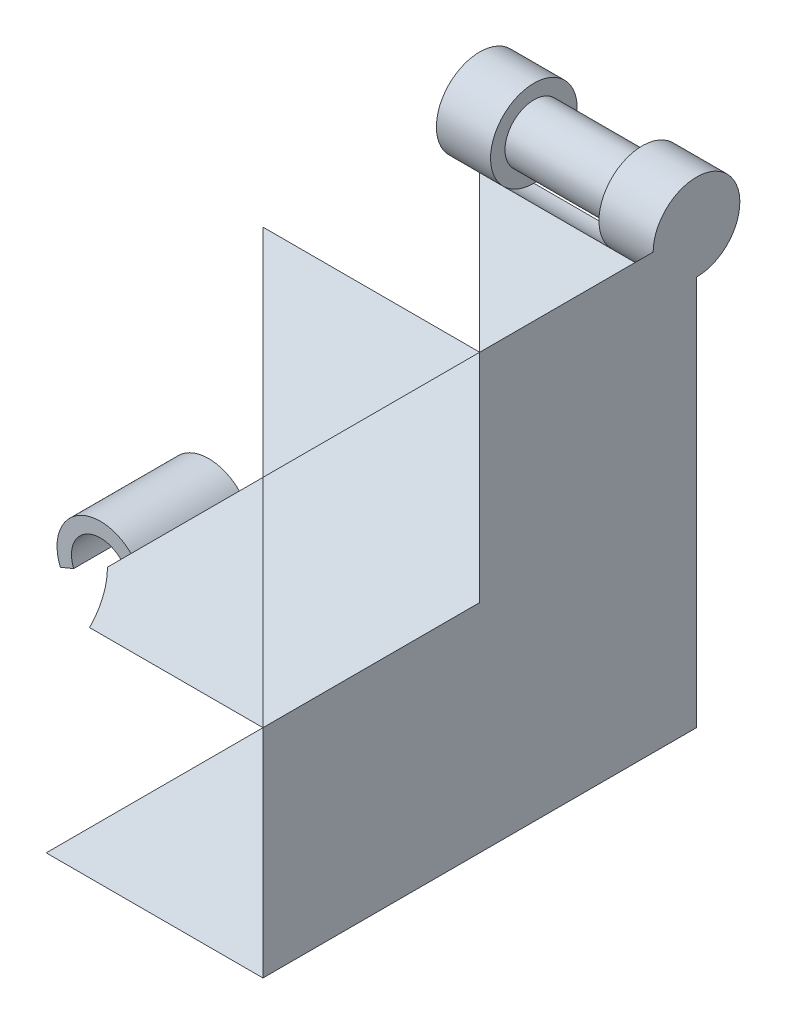
ISO-10303-21;
HEADER;
FILE_DESCRIPTION(('STEP AP214'),'2;1');
FILE_NAME('part.step','',(''),(''),'','','');
FILE_SCHEMA(('AUTOMOTIVE_DESIGN { 1 0 10303 214 1 1 1 1 }'));
ENDSEC;
DATA;
#1=APPLICATION_CONTEXT('core data for automotive mechanical design processes');
#2=APPLICATION_PROTOCOL_DEFINITION('international standard','automotive_design',2000,#1);
#3=PRODUCT_CONTEXT('',#1,'mechanical');
#4=PRODUCT('Part','Part','',(#3));
#5=PRODUCT_RELATED_PRODUCT_CATEGORY('part','',(#4));
#6=PRODUCT_DEFINITION_FORMATION('','',#4);
#7=PRODUCT_DEFINITION_CONTEXT('part definition',#1,'design');
#8=PRODUCT_DEFINITION('design','',#6,#7);
#9=PRODUCT_DEFINITION_SHAPE('','',#8);
#10=(LENGTH_UNIT() NAMED_UNIT(*) SI_UNIT(.MILLI.,.METRE.));
#11=(NAMED_UNIT(*) PLANE_ANGLE_UNIT() SI_UNIT($,.RADIAN.));
#12=(NAMED_UNIT(*) SI_UNIT($,.STERADIAN.) SOLID_ANGLE_UNIT());
#13=UNCERTAINTY_MEASURE_WITH_UNIT(LENGTH_MEASURE(1.E-05),#10,'distance_accuracy_value','');
#14=(GEOMETRIC_REPRESENTATION_CONTEXT(3) GLOBAL_UNCERTAINTY_ASSIGNED_CONTEXT((#13)) GLOBAL_UNIT_ASSIGNED_CONTEXT((#10,
#11,#12)) REPRESENTATION_CONTEXT('',''));
#15=CARTESIAN_POINT('',(0.,0.,0.));
#16=DIRECTION('',(0.,0.,1.));
#17=DIRECTION('',(1.,0.,0.));
#18=AXIS2_PLACEMENT_3D('',#15,#16,#17);
#19=CARTESIAN_POINT('',(0.,0.,0.));
#20=DIRECTION('',(0.,0.,-1.));
#21=DIRECTION('',(1.,0.,0.));
#22=AXIS2_PLACEMENT_3D('',#19,#20,#21);
#23=PLANE('',#22);
#24=DIRECTION('',(1.,0.,0.));
#25=VECTOR('',#24,1.);
#26=CARTESIAN_POINT('',(-25.063807345283,34.29,0.));
#27=LINE('',#26,#25);
#28=CARTESIAN_POINT('',(-4.7625,34.29,0.));
#29=VERTEX_POINT('',#28);
#30=CARTESIAN_POINT('',(-14.2875,34.29,0.));
#31=VERTEX_POINT('',#30);
#32=EDGE_CURVE('E224',#29,#31,#27,.F.);
#33=ORIENTED_EDGE('',*,*,#32,.F.);
#34=DIRECTION('',(1.,0.,0.));
#35=VECTOR('',#34,1.);
#36=CARTESIAN_POINT('',(-15.538807345283,34.29,0.));
#37=LINE('',#36,#35);
#38=CARTESIAN_POINT('',(0.,34.29,0.));
#39=VERTEX_POINT('',#38);
#40=EDGE_CURVE('E213',#39,#29,#37,.F.);
#41=ORIENTED_EDGE('',*,*,#40,.F.);
#42=DIRECTION('',(0.,-1.,0.));
#43=VECTOR('',#42,1.);
#44=CARTESIAN_POINT('',(0.,0.,0.));
#45=LINE('',#44,#43);
#46=CARTESIAN_POINT('',(0.,0.,0.));
#47=VERTEX_POINT('',#46);
#48=EDGE_CURVE('E185',#39,#47,#45,.T.);
#49=ORIENTED_EDGE('',*,*,#48,.T.);
#50=DIRECTION('',(-1.,0.,0.));
#51=VECTOR('',#50,1.);
#52=CARTESIAN_POINT('',(0.,0.,0.));
#53=LINE('',#52,#51);
#54=CARTESIAN_POINT('',(-34.29,0.,0.));
#55=VERTEX_POINT('',#54);
#56=EDGE_CURVE('E384',#47,#55,#53,.T.);
#57=ORIENTED_EDGE('',*,*,#56,.T.);
#58=CARTESIAN_POINT('',(-38.1,0.,0.));
#59=DIRECTION('',(0.,0.,-1.));
#60=DIRECTION('',(-1.,0.,0.));
#61=AXIS2_PLACEMENT_3D('',#58,#59,#60);
#62=CIRCLE('',#61,3.81);
#63=CARTESIAN_POINT('',(-38.1,3.81,0.));
#64=VERTEX_POINT('',#63);
#65=EDGE_CURVE('E253',#64,#55,#62,.T.);
#66=ORIENTED_EDGE('',*,*,#65,.F.);
#67=DIRECTION('',(0.,1.,0.));
#68=VECTOR('',#67,1.);
#69=CARTESIAN_POINT('',(-38.1,0.,0.));
#70=LINE('',#69,#68);
#71=CARTESIAN_POINT('',(-38.1,19.05,0.));
#72=VERTEX_POINT('',#71);
#73=EDGE_CURVE('E327',#64,#72,#70,.T.);
#74=ORIENTED_EDGE('',*,*,#73,.T.);
#75=DIRECTION('',(1.,0.,0.));
#76=VECTOR('',#75,1.);
#77=CARTESIAN_POINT('',(-19.05,19.05,0.));
#78=LINE('',#77,#76);
#79=CARTESIAN_POINT('',(-19.05,19.05,0.));
#80=VERTEX_POINT('',#79);
#81=EDGE_CURVE('E352',#72,#80,#78,.T.);
#82=ORIENTED_EDGE('',*,*,#81,.T.);
#83=DIRECTION('',(0.,1.,0.));
#84=VECTOR('',#83,1.);
#85=CARTESIAN_POINT('',(-19.05,19.05,0.));
#86=LINE('',#85,#84);
#87=CARTESIAN_POINT('',(-19.05,34.29,0.));
#88=VERTEX_POINT('',#87);
#89=EDGE_CURVE('E335',#80,#88,#86,.T.);
#90=ORIENTED_EDGE('',*,*,#89,.T.);
#91=DIRECTION('',(1.,0.,0.));
#92=VECTOR('',#91,1.);
#93=CARTESIAN_POINT('',(-19.05,34.29,0.));
#94=LINE('',#93,#92);
#95=EDGE_CURVE('E192',#31,#88,#94,.F.);
#96=ORIENTED_EDGE('',*,*,#95,.F.);
#97=EDGE_LOOP('',(#33,#41,#49,#57,#66,#74,#82,#90,#96));
#98=FACE_BOUND('',#97,.T.);
#99=ADVANCED_FACE('F44',(#98),#23,.T.);
#100=CARTESIAN_POINT('',(0.,38.1,0.));
#101=DIRECTION('',(0.,0.707106781186546,0.707106781186549));
#102=DIRECTION('',(0.,-0.707106781186549,0.707106781186546));
#103=AXIS2_PLACEMENT_3D('',#100,#101,#102);
#104=PLANE('',#103);
#105=DIRECTION('',(1.,0.,0.));
#106=VECTOR('',#105,1.);
#107=CARTESIAN_POINT('',(-19.05,35.4059231636793,2.69407683632078));
#108=LINE('',#107,#106);
#109=CARTESIAN_POINT('',(-14.2875,35.4059231636793,2.69407683632077));
#110=VERTEX_POINT('',#109);
#111=CARTESIAN_POINT('',(-16.3559231636792,35.4059231636793,2.69407683632078));
#112=VERTEX_POINT('',#111);
#113=EDGE_CURVE('E556',#110,#112,#108,.F.);
#114=ORIENTED_EDGE('',*,*,#113,.T.);
#115=DIRECTION('',(-0.577350269189627,0.577350269189627,-0.577350269189624));
#116=VECTOR('',#115,1.);
#117=CARTESIAN_POINT('',(-12.7,31.75,6.35000000000003));
#118=LINE('',#117,#116);
#119=CARTESIAN_POINT('',(-9.525,28.575,9.525));
#120=VERTEX_POINT('',#119);
#121=EDGE_CURVE('E203',#120,#112,#118,.T.);
#122=ORIENTED_EDGE('',*,*,#121,.F.);
#123=DIRECTION('',(0.577350269189627,0.577350269189627,-0.577350269189624));
#124=VECTOR('',#123,1.);
#125=CARTESIAN_POINT('',(-6.35000000000001,31.75,6.35000000000003));
#126=LINE('',#125,#124);
#127=CARTESIAN_POINT('',(-2.69407683632075,35.4059231636793,2.69407683632078));
#128=VERTEX_POINT('',#127);
#129=EDGE_CURVE('E202',#120,#128,#126,.T.);
#130=ORIENTED_EDGE('',*,*,#129,.T.);
#131=DIRECTION('',(1.,0.,0.));
#132=VECTOR('',#131,1.);
#133=CARTESIAN_POINT('',(-15.538807345283,35.4059231636793,2.69407683632078));
#134=LINE('',#133,#132);
#135=CARTESIAN_POINT('',(-4.7625,35.4059231636793,2.69407683632077));
#136=VERTEX_POINT('',#135);
#137=EDGE_CURVE('E207',#128,#136,#134,.F.);
#138=ORIENTED_EDGE('',*,*,#137,.T.);
#139=DIRECTION('',(1.,0.,0.));
#140=VECTOR('',#139,1.);
#141=CARTESIAN_POINT('',(-25.063807345283,35.4059231636793,2.69407683632077));
#142=LINE('',#141,#140);
#143=EDGE_CURVE('E11',#136,#110,#142,.F.);
#144=ORIENTED_EDGE('',*,*,#143,.T.);
#145=EDGE_LOOP('',(#114,#122,#130,#138,#144));
#146=FACE_BOUND('',#145,.T.);
#147=ADVANCED_FACE('F490',(#146),#104,.T.);
#148=CARTESIAN_POINT('',(-19.05,19.05,0.));
#149=DIRECTION('',(-0.707106781186546,0.,0.707106781186549));
#150=DIRECTION('',(-0.707106781186549,0.,-0.707106781186546));
#151=AXIS2_PLACEMENT_3D('',#148,#149,#150);
#152=PLANE('',#151);
#153=CARTESIAN_POINT('',(-19.05,38.1,0.));
#154=DIRECTION('',(0.707106781186546,0.,-0.707106781186549));
#155=DIRECTION('',(0.707106781186549,0.,0.707106781186546));
#156=AXIS2_PLACEMENT_3D('',#153,#154,#155);
#157=ELLIPSE('',#156,5.3881536726415,3.81);
#158=EDGE_CURVE('E60',#112,#88,#157,.T.);
#159=ORIENTED_EDGE('',*,*,#158,.T.);
#160=ORIENTED_EDGE('',*,*,#89,.F.);
#161=DIRECTION('',(-0.577350269189627,-0.577350269189626,-0.577350269189625));
#162=VECTOR('',#161,1.);
#163=CARTESIAN_POINT('',(-12.7,25.4000000000001,6.35000000000003));
#164=LINE('',#163,#162);
#165=EDGE_CURVE('E338',#120,#80,#164,.T.);
#166=ORIENTED_EDGE('',*,*,#165,.F.);
#167=ORIENTED_EDGE('',*,*,#121,.T.);
#168=EDGE_LOOP('',(#159,#160,#166,#167));
#169=FACE_BOUND('',#168,.T.);
#170=ADVANCED_FACE('F496',(#169),#152,.T.);
#171=CARTESIAN_POINT('',(0.,38.1,19.05));
#172=DIRECTION('',(-0.707106781186549,0.707106781186546,0.));
#173=DIRECTION('',(-0.707106781186546,-0.707106781186549,0.));
#174=AXIS2_PLACEMENT_3D('',#171,#172,#173);
#175=PLANE('',#174);
#176=CARTESIAN_POINT('',(0.,38.1,0.));
#177=DIRECTION('',(0.707106781186549,-0.707106781186546,0.));
#178=DIRECTION('',(0.707106781186546,0.707106781186549,0.));
#179=AXIS2_PLACEMENT_3D('',#176,#177,#178);
#180=ELLIPSE('',#179,5.38815367264148,3.81);
#181=CARTESIAN_POINT('',(0.,38.1,3.81000000000003));
#182=VERTEX_POINT('',#181);
#183=EDGE_CURVE('E197',#182,#128,#180,.T.);
#184=ORIENTED_EDGE('',*,*,#183,.T.);
#185=ORIENTED_EDGE('',*,*,#129,.F.);
#186=DIRECTION('',(0.577350269189622,0.577350269189627,0.577350269189629));
#187=VECTOR('',#186,1.);
#188=CARTESIAN_POINT('',(-6.35000000000004,31.75,12.7));
#189=LINE('',#188,#187);
#190=CARTESIAN_POINT('',(0.,38.1,19.05));
#191=VERTEX_POINT('',#190);
#192=EDGE_CURVE('E200',#120,#191,#189,.T.);
#193=ORIENTED_EDGE('',*,*,#192,.T.);
#194=DIRECTION('',(0.,0.,1.));
#195=VECTOR('',#194,1.);
#196=CARTESIAN_POINT('',(0.,38.1,19.05));
#197=LINE('',#196,#195);
#198=EDGE_CURVE('E182',#182,#191,#197,.T.);
#199=ORIENTED_EDGE('',*,*,#198,.F.);
#200=EDGE_LOOP('',(#184,#185,#193,#199));
#201=FACE_BOUND('',#200,.T.);
#202=ADVANCED_FACE('F195',(#201),#175,.T.);
#203=CARTESIAN_POINT('',(0.,0.,38.1));
#204=DIRECTION('',(0.,-1.,0.));
#205=DIRECTION('',(1.,0.,0.));
#206=AXIS2_PLACEMENT_3D('',#203,#204,#205);
#207=PLANE('',#206);
#208=DIRECTION('',(0.,0.,-1.));
#209=VECTOR('',#208,1.);
#210=CARTESIAN_POINT('',(-34.29,0.,14.2875));
#211=LINE('',#210,#209);
#212=CARTESIAN_POINT('',(-34.29,0.,4.7625));
#213=VERTEX_POINT('',#212);
#214=CARTESIAN_POINT('',(-34.29,0.,14.2875));
#215=VERTEX_POINT('',#214);
#216=EDGE_CURVE('E320',#213,#215,#211,.F.);
#217=ORIENTED_EDGE('',*,*,#216,.F.);
#218=DIRECTION('',(0.,0.,-1.));
#219=VECTOR('',#218,1.);
#220=CARTESIAN_POINT('',(-34.29,0.,15.538807345283));
#221=LINE('',#220,#219);
#222=EDGE_CURVE('E268',#55,#213,#221,.F.);
#223=ORIENTED_EDGE('',*,*,#222,.F.);
#224=ORIENTED_EDGE('',*,*,#56,.F.);
#225=DIRECTION('',(0.,0.,1.));
#226=VECTOR('',#225,1.);
#227=CARTESIAN_POINT('',(0.,0.,38.1));
#228=LINE('',#227,#226);
#229=CARTESIAN_POINT('',(0.,0.,38.1));
#230=VERTEX_POINT('',#229);
#231=EDGE_CURVE('E400',#47,#230,#228,.T.);
#232=ORIENTED_EDGE('',*,*,#231,.T.);
#233=DIRECTION('',(-1.,0.,0.));
#234=VECTOR('',#233,1.);
#235=CARTESIAN_POINT('',(0.,0.,38.1));
#236=LINE('',#235,#234);
#237=CARTESIAN_POINT('',(-19.05,0.,38.1));
#238=VERTEX_POINT('',#237);
#239=EDGE_CURVE('E404',#230,#238,#236,.T.);
#240=ORIENTED_EDGE('',*,*,#239,.T.);
#241=DIRECTION('',(0.,0.,-1.));
#242=VECTOR('',#241,1.);
#243=CARTESIAN_POINT('',(-19.05,0.,38.1));
#244=LINE('',#243,#242);
#245=CARTESIAN_POINT('',(-19.05,0.,19.05));
#246=VERTEX_POINT('',#245);
#247=EDGE_CURVE('E393',#238,#246,#244,.T.);
#248=ORIENTED_EDGE('',*,*,#247,.T.);
#249=DIRECTION('',(-1.,0.,0.));
#250=VECTOR('',#249,1.);
#251=CARTESIAN_POINT('',(-19.05,0.,19.05));
#252=LINE('',#251,#250);
#253=CARTESIAN_POINT('',(-34.29,0.,19.05));
#254=VERTEX_POINT('',#253);
#255=EDGE_CURVE('E360',#246,#254,#252,.T.);
#256=ORIENTED_EDGE('',*,*,#255,.T.);
#257=DIRECTION('',(0.,0.,-1.));
#258=VECTOR('',#257,1.);
#259=CARTESIAN_POINT('',(-34.29,0.,19.05));
#260=LINE('',#259,#258);
#261=EDGE_CURVE('E249',#215,#254,#260,.F.);
#262=ORIENTED_EDGE('',*,*,#261,.F.);
#263=EDGE_LOOP('',(#217,#223,#224,#232,#240,#248,#256,#262));
#264=FACE_BOUND('',#263,.T.);
#265=ADVANCED_FACE('F472',(#264),#207,.T.);
#266=CARTESIAN_POINT('',(-38.1,0.,19.05));
#267=DIRECTION('',(-0.707106781186546,0.707106781186549,0.));
#268=DIRECTION('',(-0.707106781186549,-0.707106781186546,0.));
#269=AXIS2_PLACEMENT_3D('',#266,#267,#268);
#270=PLANE('',#269);
#271=DIRECTION('',(0.,0.,-1.));
#272=VECTOR('',#271,1.);
#273=CARTESIAN_POINT('',(-35.4059231636793,2.69407683632077,19.05));
#274=LINE('',#273,#272);
#275=CARTESIAN_POINT('',(-35.4059231636793,2.69407683632076,14.2875));
#276=VERTEX_POINT('',#275);
#277=CARTESIAN_POINT('',(-35.4059231636793,2.69407683632077,16.3559231636793));
#278=VERTEX_POINT('',#277);
#279=EDGE_CURVE('E245',#276,#278,#274,.F.);
#280=ORIENTED_EDGE('',*,*,#279,.T.);
#281=DIRECTION('',(-0.577350269189627,-0.577350269189622,0.577350269189629));
#282=VECTOR('',#281,1.);
#283=CARTESIAN_POINT('',(-38.1,0.,19.05));
#284=LINE('',#283,#282);
#285=CARTESIAN_POINT('',(-28.575,9.525,9.525));
#286=VERTEX_POINT('',#285);
#287=EDGE_CURVE('E366',#286,#278,#284,.T.);
#288=ORIENTED_EDGE('',*,*,#287,.F.);
#289=DIRECTION('',(-0.577350269189627,-0.577350269189626,-0.577350269189625));
#290=VECTOR('',#289,1.);
#291=CARTESIAN_POINT('',(-31.75,6.35000000000002,6.35000000000003));
#292=LINE('',#291,#290);
#293=CARTESIAN_POINT('',(-35.4059231636793,2.69407683632074,2.69407683632077));
#294=VERTEX_POINT('',#293);
#295=EDGE_CURVE('E367',#286,#294,#292,.T.);
#296=ORIENTED_EDGE('',*,*,#295,.T.);
#297=DIRECTION('',(0.,0.,-1.));
#298=VECTOR('',#297,1.);
#299=CARTESIAN_POINT('',(-35.4059231636793,2.69407683632077,15.538807345283));
#300=LINE('',#299,#298);
#301=CARTESIAN_POINT('',(-35.4059231636793,2.69407683632074,4.7625));
#302=VERTEX_POINT('',#301);
#303=EDGE_CURVE('E264',#294,#302,#300,.F.);
#304=ORIENTED_EDGE('',*,*,#303,.T.);
#305=DIRECTION('',(0.,0.,-1.));
#306=VECTOR('',#305,1.);
#307=CARTESIAN_POINT('',(-35.4059231636793,2.69407683632077,14.2875));
#308=LINE('',#307,#306);
#309=EDGE_CURVE('E53',#302,#276,#308,.F.);
#310=ORIENTED_EDGE('',*,*,#309,.T.);
#311=EDGE_LOOP('',(#280,#288,#296,#304,#310));
#312=FACE_BOUND('',#311,.T.);
#313=ADVANCED_FACE('F433',(#312),#270,.T.);
#314=CARTESIAN_POINT('',(-19.05,0.,19.05));
#315=DIRECTION('',(0.,0.707106781186551,0.707106781186544));
#316=DIRECTION('',(0.,-0.707106781186544,0.707106781186551));
#317=AXIS2_PLACEMENT_3D('',#314,#315,#316);
#318=PLANE('',#317);
#319=CARTESIAN_POINT('',(-38.1,0.,19.0500000000001));
#320=DIRECTION('',(0.,-0.707106781186551,-0.707106781186544));
#321=DIRECTION('',(0.,0.707106781186544,-0.707106781186551));
#322=AXIS2_PLACEMENT_3D('',#319,#320,#321);
#323=ELLIPSE('',#322,5.38815367264152,3.81);
#324=EDGE_CURVE('E242',#278,#254,#323,.T.);
#325=ORIENTED_EDGE('',*,*,#324,.T.);
#326=ORIENTED_EDGE('',*,*,#255,.F.);
#327=DIRECTION('',(0.577350269189627,-0.577350269189622,0.577350269189629));
#328=VECTOR('',#327,1.);
#329=CARTESIAN_POINT('',(-19.05,0.,19.05));
#330=LINE('',#329,#328);
#331=EDGE_CURVE('E372',#286,#246,#330,.T.);
#332=ORIENTED_EDGE('',*,*,#331,.F.);
#333=ORIENTED_EDGE('',*,*,#287,.T.);
#334=EDGE_LOOP('',(#325,#326,#332,#333));
#335=FACE_BOUND('',#334,.T.);
#336=ADVANCED_FACE('F444',(#335),#318,.T.);
#337=CARTESIAN_POINT('',(-38.1,0.,0.));
#338=DIRECTION('',(-0.707106781186546,0.,0.707106781186549));
#339=DIRECTION('',(-0.707106781186549,0.,-0.707106781186546));
#340=AXIS2_PLACEMENT_3D('',#337,#338,#339);
#341=PLANE('',#340);
#342=CARTESIAN_POINT('',(-38.1,0.,0.));
#343=DIRECTION('',(0.707106781186546,0.,-0.707106781186549));
#344=DIRECTION('',(-0.707106781186549,0.,-0.707106781186546));
#345=AXIS2_PLACEMENT_3D('',#342,#343,#344);
#346=ELLIPSE('',#345,5.38815367264148,3.81);
#347=EDGE_CURVE('E261',#64,#294,#346,.T.);
#348=ORIENTED_EDGE('',*,*,#347,.T.);
#349=ORIENTED_EDGE('',*,*,#295,.F.);
#350=DIRECTION('',(-0.577350269189627,0.577350269189627,-0.577350269189624));
#351=VECTOR('',#350,1.);
#352=CARTESIAN_POINT('',(-31.75,12.7,6.35000000000003));
#353=LINE('',#352,#351);
#354=EDGE_CURVE('E357',#286,#72,#353,.T.);
#355=ORIENTED_EDGE('',*,*,#354,.T.);
#356=ORIENTED_EDGE('',*,*,#73,.F.);
#357=EDGE_LOOP('',(#348,#349,#355,#356));
#358=FACE_BOUND('',#357,.T.);
#359=ADVANCED_FACE('F447',(#358),#341,.T.);
#360=CARTESIAN_POINT('',(-19.05,0.,38.1));
#361=DIRECTION('',(-0.707106781186546,0.707106781186549,0.));
#362=DIRECTION('',(-0.707106781186549,-0.707106781186546,0.));
#363=AXIS2_PLACEMENT_3D('',#360,#361,#362);
#364=PLANE('',#363);
#365=ORIENTED_EDGE('',*,*,#247,.F.);
#366=DIRECTION('',(-0.577350269189627,-0.577350269189622,0.577350269189629));
#367=VECTOR('',#366,1.);
#368=CARTESIAN_POINT('',(-19.05,0.,38.1));
#369=LINE('',#368,#367);
#370=CARTESIAN_POINT('',(-9.525,9.525,28.575));
#371=VERTEX_POINT('',#370);
#372=EDGE_CURVE('E408',#371,#238,#369,.T.);
#373=ORIENTED_EDGE('',*,*,#372,.F.);
#374=DIRECTION('',(-0.577350269189627,-0.577350269189626,-0.577350269189625));
#375=VECTOR('',#374,1.);
#376=CARTESIAN_POINT('',(-12.7,6.35000000000002,25.4));
#377=LINE('',#376,#375);
#378=EDGE_CURVE('E409',#371,#246,#377,.T.);
#379=ORIENTED_EDGE('',*,*,#378,.T.);
#380=EDGE_LOOP('',(#365,#373,#379));
#381=FACE_BOUND('',#380,.T.);
#382=ADVANCED_FACE('F515',(#381),#364,.T.);
#383=CARTESIAN_POINT('',(0.,0.,38.1));
#384=DIRECTION('',(0.,0.707106781186551,0.707106781186544));
#385=DIRECTION('',(0.,-0.707106781186544,0.707106781186551));
#386=AXIS2_PLACEMENT_3D('',#383,#384,#385);
#387=PLANE('',#386);
#388=ORIENTED_EDGE('',*,*,#239,.F.);
#389=DIRECTION('',(0.577350269189627,-0.577350269189622,0.577350269189629));
#390=VECTOR('',#389,1.);
#391=CARTESIAN_POINT('',(0.,0.,38.1));
#392=LINE('',#391,#390);
#393=EDGE_CURVE('E413',#371,#230,#392,.T.);
#394=ORIENTED_EDGE('',*,*,#393,.F.);
#395=ORIENTED_EDGE('',*,*,#372,.T.);
#396=EDGE_LOOP('',(#388,#394,#395));
#397=FACE_BOUND('',#396,.T.);
#398=ADVANCED_FACE('F508',(#397),#387,.T.);
#399=CARTESIAN_POINT('',(-19.05,0.,19.05));
#400=DIRECTION('',(-0.707106781186546,0.,0.707106781186549));
#401=DIRECTION('',(-0.707106781186549,0.,-0.707106781186546));
#402=AXIS2_PLACEMENT_3D('',#399,#400,#401);
#403=PLANE('',#402);
#404=ORIENTED_EDGE('',*,*,#378,.F.);
#405=DIRECTION('',(-0.577350269189627,0.577350269189627,-0.577350269189624));
#406=VECTOR('',#405,1.);
#407=CARTESIAN_POINT('',(-12.7,12.7,25.4));
#408=LINE('',#407,#406);
#409=CARTESIAN_POINT('',(-19.05,19.05,19.05));
#410=VERTEX_POINT('',#409);
#411=EDGE_CURVE('E389',#371,#410,#408,.T.);
#412=ORIENTED_EDGE('',*,*,#411,.T.);
#413=DIRECTION('',(0.577350269189622,0.577350269189627,0.577350269189629));
#414=VECTOR('',#413,1.);
#415=CARTESIAN_POINT('',(-25.4000000000001,12.7,12.7));
#416=LINE('',#415,#414);
#417=EDGE_CURVE('E371',#286,#410,#416,.T.);
#418=ORIENTED_EDGE('',*,*,#417,.F.);
#419=ORIENTED_EDGE('',*,*,#331,.T.);
#420=EDGE_LOOP('',(#404,#412,#418,#419));
#421=FACE_BOUND('',#420,.T.);
#422=ADVANCED_FACE('F504',(#421),#403,.T.);
#423=CARTESIAN_POINT('',(0.,19.05,19.05));
#424=DIRECTION('',(0.,0.707106781186546,0.707106781186549));
#425=DIRECTION('',(0.,-0.707106781186549,0.707106781186546));
#426=AXIS2_PLACEMENT_3D('',#423,#424,#425);
#427=PLANE('',#426);
#428=ORIENTED_EDGE('',*,*,#411,.F.);
#429=DIRECTION('',(0.577350269189627,0.577350269189627,-0.577350269189624));
#430=VECTOR('',#429,1.);
#431=CARTESIAN_POINT('',(-6.35000000000002,12.7,25.4));
#432=LINE('',#431,#430);
#433=CARTESIAN_POINT('',(0.,19.05,19.05));
#434=VERTEX_POINT('',#433);
#435=EDGE_CURVE('E388',#371,#434,#432,.T.);
#436=ORIENTED_EDGE('',*,*,#435,.T.);
#437=DIRECTION('',(0.577350269189627,-0.577350269189622,0.577350269189629));
#438=VECTOR('',#437,1.);
#439=CARTESIAN_POINT('',(0.,19.0500000000001,19.05));
#440=LINE('',#439,#438);
#441=EDGE_CURVE('E331',#120,#434,#440,.T.);
#442=ORIENTED_EDGE('',*,*,#441,.F.);
#443=DIRECTION('',(-0.577350269189627,-0.577350269189622,0.577350269189629));
#444=VECTOR('',#443,1.);
#445=CARTESIAN_POINT('',(-19.05,19.0500000000001,19.05));
#446=LINE('',#445,#444);
#447=EDGE_CURVE('E324',#120,#410,#446,.T.);
#448=ORIENTED_EDGE('',*,*,#447,.T.);
#449=EDGE_LOOP('',(#428,#436,#442,#448));
#450=FACE_BOUND('',#449,.T.);
#451=ADVANCED_FACE('F507',(#450),#427,.T.);
#452=CARTESIAN_POINT('',(0.,19.05,38.1));
#453=DIRECTION('',(-0.707106781186549,0.707106781186546,0.));
#454=DIRECTION('',(-0.707106781186546,-0.707106781186549,0.));
#455=AXIS2_PLACEMENT_3D('',#452,#453,#454);
#456=PLANE('',#455);
#457=DIRECTION('',(0.,0.,1.));
#458=VECTOR('',#457,1.);
#459=CARTESIAN_POINT('',(0.,19.05,38.1));
#460=LINE('',#459,#458);
#461=CARTESIAN_POINT('',(0.,19.05,38.1));
#462=VERTEX_POINT('',#461);
#463=EDGE_CURVE('E412',#434,#462,#460,.T.);
#464=ORIENTED_EDGE('',*,*,#463,.F.);
#465=ORIENTED_EDGE('',*,*,#435,.F.);
#466=DIRECTION('',(0.577350269189622,0.577350269189627,0.577350269189629));
#467=VECTOR('',#466,1.);
#468=CARTESIAN_POINT('',(-6.35000000000004,12.7,31.75));
#469=LINE('',#468,#467);
#470=EDGE_CURVE('E425',#371,#462,#469,.T.);
#471=ORIENTED_EDGE('',*,*,#470,.T.);
#472=EDGE_LOOP('',(#464,#465,#471));
#473=FACE_BOUND('',#472,.T.);
#474=ADVANCED_FACE('F46',(#473),#456,.T.);
#475=CARTESIAN_POINT('',(0.,0.,38.1));
#476=DIRECTION('',(-0.707106781186551,0.,0.707106781186544));
#477=DIRECTION('',(-0.707106781186544,0.,-0.707106781186551));
#478=AXIS2_PLACEMENT_3D('',#475,#476,#477);
#479=PLANE('',#478);
#480=DIRECTION('',(0.,-1.,0.));
#481=VECTOR('',#480,1.);
#482=CARTESIAN_POINT('',(0.,0.,38.1));
#483=LINE('',#482,#481);
#484=EDGE_CURVE('E422',#462,#230,#483,.T.);
#485=ORIENTED_EDGE('',*,*,#484,.F.);
#486=ORIENTED_EDGE('',*,*,#470,.F.);
#487=ORIENTED_EDGE('',*,*,#393,.T.);
#488=EDGE_LOOP('',(#485,#486,#487));
#489=FACE_BOUND('',#488,.T.);
#490=ADVANCED_FACE('F524',(#489),#479,.T.);
#491=CARTESIAN_POINT('',(0.,0.,38.1));
#492=DIRECTION('',(1.,0.,0.));
#493=DIRECTION('',(0.,0.,1.));
#494=AXIS2_PLACEMENT_3D('',#491,#492,#493);
#495=PLANE('',#494);
#496=CARTESIAN_POINT('',(0.,38.1,0.));
#497=DIRECTION('',(1.,0.,0.));
#498=DIRECTION('',(0.,0.,-1.));
#499=AXIS2_PLACEMENT_3D('',#496,#497,#498);
#500=CIRCLE('',#499,3.81);
#501=EDGE_CURVE('E179',#39,#182,#500,.T.);
#502=ORIENTED_EDGE('',*,*,#501,.T.);
#503=ORIENTED_EDGE('',*,*,#198,.T.);
#504=DIRECTION('',(0.,-1.,0.));
#505=VECTOR('',#504,1.);
#506=CARTESIAN_POINT('',(0.,19.05,19.05));
#507=LINE('',#506,#505);
#508=EDGE_CURVE('E328',#191,#434,#507,.T.);
#509=ORIENTED_EDGE('',*,*,#508,.T.);
#510=ORIENTED_EDGE('',*,*,#463,.T.);
#511=ORIENTED_EDGE('',*,*,#484,.T.);
#512=ORIENTED_EDGE('',*,*,#231,.F.);
#513=ORIENTED_EDGE('',*,*,#48,.F.);
#514=EDGE_LOOP('',(#502,#503,#509,#510,#511,#512,#513));
#515=FACE_BOUND('',#514,.T.);
#516=ADVANCED_FACE('F181',(#515),#495,.T.);
#517=CARTESIAN_POINT('',(-19.05,19.05,0.));
#518=DIRECTION('',(0.,0.707106781186546,0.707106781186549));
#519=DIRECTION('',(0.,-0.707106781186549,0.707106781186546));
#520=AXIS2_PLACEMENT_3D('',#517,#518,#519);
#521=PLANE('',#520);
#522=ORIENTED_EDGE('',*,*,#81,.F.);
#523=ORIENTED_EDGE('',*,*,#354,.F.);
#524=DIRECTION('',(0.577350269189627,0.577350269189627,-0.577350269189624));
#525=VECTOR('',#524,1.);
#526=CARTESIAN_POINT('',(-25.4000000000001,12.7,6.35000000000003));
#527=LINE('',#526,#525);
#528=EDGE_CURVE('E356',#286,#80,#527,.T.);
#529=ORIENTED_EDGE('',*,*,#528,.T.);
#530=EDGE_LOOP('',(#522,#523,#529));
#531=FACE_BOUND('',#530,.T.);
#532=ADVANCED_FACE('F523',(#531),#521,.T.);
#533=CARTESIAN_POINT('',(-19.0500000000001,19.05,19.05));
#534=DIRECTION('',(-0.707106781186549,0.707106781186546,0.));
#535=DIRECTION('',(-0.707106781186546,-0.707106781186549,0.));
#536=AXIS2_PLACEMENT_3D('',#533,#534,#535);
#537=PLANE('',#536);
#538=ORIENTED_EDGE('',*,*,#528,.F.);
#539=ORIENTED_EDGE('',*,*,#417,.T.);
#540=ORIENTED_EDGE('',*,*,#447,.F.);
#541=ORIENTED_EDGE('',*,*,#165,.T.);
#542=EDGE_LOOP('',(#538,#539,#540,#541));
#543=FACE_BOUND('',#542,.T.);
#544=ADVANCED_FACE('F502',(#543),#537,.T.);
#545=CARTESIAN_POINT('',(0.,19.05,19.05));
#546=DIRECTION('',(-0.707106781186551,0.,0.707106781186544));
#547=DIRECTION('',(-0.707106781186544,0.,-0.707106781186551));
#548=AXIS2_PLACEMENT_3D('',#545,#546,#547);
#549=PLANE('',#548);
#550=ORIENTED_EDGE('',*,*,#508,.F.);
#551=ORIENTED_EDGE('',*,*,#192,.F.);
#552=ORIENTED_EDGE('',*,*,#441,.T.);
#553=EDGE_LOOP('',(#550,#551,#552));
#554=FACE_BOUND('',#553,.T.);
#555=ADVANCED_FACE('F537',(#554),#549,.T.);
#556=CARTESIAN_POINT('',(-5.57961581839613,13.4703841816036,14.2875));
#557=DIRECTION('',(0.382683432365085,-0.923879532511289,0.));
#558=DIRECTION('',(-0.923879532511289,-0.382683432365085,0.));
#559=AXIS2_PLACEMENT_3D('',#556,#557,#558);
#560=PLANE('',#559);
#561=DIRECTION('',(0.923879532511289,0.382683432365085,0.));
#562=VECTOR('',#561,1.);
#563=CARTESIAN_POINT('',(-5.57961581839613,13.4703841816036,4.7625));
#564=LINE('',#563,#562);
#565=CARTESIAN_POINT('',(-41.6199810188681,-1.45802387731097,4.7625));
#566=VERTEX_POINT('',#565);
#567=CARTESIAN_POINT('',(-40.4466540125787,-0.972015918207312,4.7625));
#568=VERTEX_POINT('',#567);
#569=EDGE_CURVE('E272',#566,#568,#564,.T.);
#570=ORIENTED_EDGE('',*,*,#569,.T.);
#571=DIRECTION('',(0.,0.,-1.));
#572=VECTOR('',#571,1.);
#573=CARTESIAN_POINT('',(-40.4466540125787,-0.972015918207312,14.2875));
#574=LINE('',#573,#572);
#575=CARTESIAN_POINT('',(-40.4466540125787,-0.972015918207312,14.2875));
#576=VERTEX_POINT('',#575);
#577=EDGE_CURVE('E291',#576,#568,#574,.T.);
#578=ORIENTED_EDGE('',*,*,#577,.F.);
#579=DIRECTION('',(0.923879532511289,0.382683432365085,0.));
#580=VECTOR('',#579,1.);
#581=CARTESIAN_POINT('',(-5.57961581839613,13.4703841816036,14.2875));
#582=LINE('',#581,#580);
#583=CARTESIAN_POINT('',(-41.6199810188681,-1.45802387731097,14.2875));
#584=VERTEX_POINT('',#583);
#585=EDGE_CURVE('E273',#584,#576,#582,.T.);
#586=ORIENTED_EDGE('',*,*,#585,.F.);
#587=DIRECTION('',(0.,0.,-1.));
#588=VECTOR('',#587,1.);
#589=CARTESIAN_POINT('',(-41.6199810188681,-1.45802387731097,14.2875));
#590=LINE('',#589,#588);
#591=EDGE_CURVE('E316',#584,#566,#590,.T.);
#592=ORIENTED_EDGE('',*,*,#591,.T.);
#593=EDGE_LOOP('',(#570,#578,#586,#592));
#594=FACE_BOUND('',#593,.T.);
#595=ADVANCED_FACE('F463',(#594),#560,.T.);
#596=CARTESIAN_POINT('',(0.,0.,14.2875));
#597=DIRECTION('',(0.,0.,1.));
#598=DIRECTION('',(-1.,0.,0.));
#599=AXIS2_PLACEMENT_3D('',#596,#597,#598);
#600=PLANE('',#599);
#601=CARTESIAN_POINT('',(-38.1,0.,14.2875));
#602=DIRECTION('',(0.,0.,-1.));
#603=DIRECTION('',(-1.,0.,0.));
#604=AXIS2_PLACEMENT_3D('',#601,#602,#603);
#605=CIRCLE('',#604,3.81);
#606=EDGE_CURVE('E279',#584,#276,#605,.T.);
#607=ORIENTED_EDGE('',*,*,#606,.F.);
#608=ORIENTED_EDGE('',*,*,#585,.T.);
#609=CARTESIAN_POINT('',(-38.1,0.,14.2875));
#610=DIRECTION('',(0.,0.,-1.));
#611=DIRECTION('',(-1.,0.,0.));
#612=AXIS2_PLACEMENT_3D('',#609,#610,#611);
#613=CIRCLE('',#612,2.54);
#614=CARTESIAN_POINT('',(-35.7533459874214,-0.972015918207334,14.2875));
#615=VERTEX_POINT('',#614);
#616=EDGE_CURVE('E287',#576,#615,#613,.T.);
#617=ORIENTED_EDGE('',*,*,#616,.T.);
#618=DIRECTION('',(-0.923879532511286,0.382683432365091,0.));
#619=VECTOR('',#618,1.);
#620=CARTESIAN_POINT('',(-5.57961581839631,-13.4703841816038,14.2875));
#621=LINE('',#620,#619);
#622=CARTESIAN_POINT('',(-34.580018981132,-1.458023877311,14.2875));
#623=VERTEX_POINT('',#622);
#624=EDGE_CURVE('E283',#623,#615,#621,.T.);
#625=ORIENTED_EDGE('',*,*,#624,.F.);
#626=EDGE_CURVE('E277',#215,#623,#605,.T.);
#627=ORIENTED_EDGE('',*,*,#626,.F.);
#628=CARTESIAN_POINT('',(-38.1,0.,14.2875));
#629=DIRECTION('',(0.,0.,-1.));
#630=DIRECTION('',(-1.,0.,0.));
#631=AXIS2_PLACEMENT_3D('',#628,#629,#630);
#632=CIRCLE('',#631,3.81);
#633=EDGE_CURVE('E236',#276,#215,#632,.T.);
#634=ORIENTED_EDGE('',*,*,#633,.F.);
#635=EDGE_LOOP('',(#607,#608,#617,#625,#627,#634));
#636=FACE_BOUND('',#635,.T.);
#637=ADVANCED_FACE('F466',(#636),#600,.T.);
#638=CARTESIAN_POINT('',(0.,0.,4.7625));
#639=DIRECTION('',(0.,0.,1.));
#640=DIRECTION('',(-1.,0.,0.));
#641=AXIS2_PLACEMENT_3D('',#638,#639,#640);
#642=PLANE('',#641);
#643=CARTESIAN_POINT('',(-38.1,0.,4.7625));
#644=DIRECTION('',(0.,0.,-1.));
#645=DIRECTION('',(-1.,0.,0.));
#646=AXIS2_PLACEMENT_3D('',#643,#644,#645);
#647=CIRCLE('',#646,2.54);
#648=CARTESIAN_POINT('',(-35.7533459874214,-0.972015918207334,4.7625));
#649=VERTEX_POINT('',#648);
#650=EDGE_CURVE('E278',#568,#649,#647,.T.);
#651=ORIENTED_EDGE('',*,*,#650,.F.);
#652=ORIENTED_EDGE('',*,*,#569,.F.);
#653=CARTESIAN_POINT('',(-38.1,0.,4.7625));
#654=DIRECTION('',(0.,0.,-1.));
#655=DIRECTION('',(-1.,0.,0.));
#656=AXIS2_PLACEMENT_3D('',#653,#654,#655);
#657=CIRCLE('',#656,3.81);
#658=EDGE_CURVE('E296',#566,#302,#657,.T.);
#659=ORIENTED_EDGE('',*,*,#658,.T.);
#660=CARTESIAN_POINT('',(-38.1,0.,4.7625));
#661=DIRECTION('',(0.,0.,-1.));
#662=DIRECTION('',(-1.,0.,0.));
#663=AXIS2_PLACEMENT_3D('',#660,#661,#662);
#664=CIRCLE('',#663,3.81);
#665=EDGE_CURVE('E257',#302,#213,#664,.T.);
#666=ORIENTED_EDGE('',*,*,#665,.T.);
#667=CARTESIAN_POINT('',(-34.580018981132,-1.458023877311,4.7625));
#668=VERTEX_POINT('',#667);
#669=EDGE_CURVE('E295',#213,#668,#657,.T.);
#670=ORIENTED_EDGE('',*,*,#669,.T.);
#671=DIRECTION('',(-0.923879532511286,0.382683432365091,0.));
#672=VECTOR('',#671,1.);
#673=CARTESIAN_POINT('',(-5.57961581839631,-13.4703841816038,4.7625));
#674=LINE('',#673,#672);
#675=EDGE_CURVE('E300',#668,#649,#674,.T.);
#676=ORIENTED_EDGE('',*,*,#675,.T.);
#677=EDGE_LOOP('',(#651,#652,#659,#666,#670,#676));
#678=FACE_BOUND('',#677,.T.);
#679=ADVANCED_FACE('F458',(#678),#642,.F.);
#680=CARTESIAN_POINT('',(-38.1,0.,14.2875));
#681=DIRECTION('',(0.,0.,-1.));
#682=DIRECTION('',(1.,0.,0.));
#683=AXIS2_PLACEMENT_3D('',#680,#681,#682);
#684=CYLINDRICAL_SURFACE('',#683,2.54);
#685=ORIENTED_EDGE('',*,*,#616,.F.);
#686=ORIENTED_EDGE('',*,*,#577,.T.);
#687=ORIENTED_EDGE('',*,*,#650,.T.);
#688=DIRECTION('',(0.,0.,-1.));
#689=VECTOR('',#688,1.);
#690=CARTESIAN_POINT('',(-35.7533459874214,-0.972015918207334,14.2875));
#691=LINE('',#690,#689);
#692=EDGE_CURVE('E310',#615,#649,#691,.T.);
#693=ORIENTED_EDGE('',*,*,#692,.F.);
#694=EDGE_LOOP('',(#685,#686,#687,#693));
#695=FACE_BOUND('',#694,.T.);
#696=ADVANCED_FACE('F478',(#695),#684,.F.);
#697=CARTESIAN_POINT('',(-38.1,0.,14.2875));
#698=DIRECTION('',(0.,0.,-1.));
#699=DIRECTION('',(1.,0.,0.));
#700=AXIS2_PLACEMENT_3D('',#697,#698,#699);
#701=CYLINDRICAL_SURFACE('',#700,3.81);
#702=ORIENTED_EDGE('',*,*,#658,.F.);
#703=ORIENTED_EDGE('',*,*,#591,.F.);
#704=ORIENTED_EDGE('',*,*,#606,.T.);
#705=ORIENTED_EDGE('',*,*,#309,.F.);
#706=EDGE_LOOP('',(#702,#703,#704,#705));
#707=FACE_BOUND('',#706,.T.);
#708=ADVANCED_FACE('F460',(#707),#701,.T.);
#709=ORIENTED_EDGE('',*,*,#216,.T.);
#710=ORIENTED_EDGE('',*,*,#626,.T.);
#711=DIRECTION('',(0.,0.,-1.));
#712=VECTOR('',#711,1.);
#713=CARTESIAN_POINT('',(-34.580018981132,-1.458023877311,14.2875));
#714=LINE('',#713,#712);
#715=EDGE_CURVE('E313',#623,#668,#714,.T.);
#716=ORIENTED_EDGE('',*,*,#715,.T.);
#717=ORIENTED_EDGE('',*,*,#669,.F.);
#718=EDGE_LOOP('',(#709,#710,#716,#717));
#719=FACE_BOUND('',#718,.T.);
#720=ADVANCED_FACE('F473',(#719),#701,.T.);
#721=CARTESIAN_POINT('',(-5.57961581839631,-13.4703841816038,14.2875));
#722=DIRECTION('',(0.382683432365091,0.923879532511286,0.));
#723=DIRECTION('',(0.923879532511286,-0.382683432365091,0.));
#724=AXIS2_PLACEMENT_3D('',#721,#722,#723);
#725=PLANE('',#724);
#726=ORIENTED_EDGE('',*,*,#675,.F.);
#727=ORIENTED_EDGE('',*,*,#715,.F.);
#728=ORIENTED_EDGE('',*,*,#624,.T.);
#729=ORIENTED_EDGE('',*,*,#692,.T.);
#730=EDGE_LOOP('',(#726,#727,#728,#729));
#731=FACE_BOUND('',#730,.T.);
#732=ADVANCED_FACE('F479',(#731),#725,.F.);
#733=CARTESIAN_POINT('',(-38.1,0.,15.538807345283));
#734=DIRECTION('',(0.,0.,-1.));
#735=DIRECTION('',(1.,0.,0.));
#736=AXIS2_PLACEMENT_3D('',#733,#734,#735);
#737=CYLINDRICAL_SURFACE('',#736,3.81);
#738=ORIENTED_EDGE('',*,*,#65,.T.);
#739=ORIENTED_EDGE('',*,*,#222,.T.);
#740=ORIENTED_EDGE('',*,*,#665,.F.);
#741=ORIENTED_EDGE('',*,*,#303,.F.);
#742=ORIENTED_EDGE('',*,*,#347,.F.);
#743=EDGE_LOOP('',(#738,#739,#740,#741,#742));
#744=FACE_BOUND('',#743,.T.);
#745=ADVANCED_FACE('F453',(#744),#737,.F.);
#746=CARTESIAN_POINT('',(-38.1,0.,19.05));
#747=DIRECTION('',(0.,0.,-1.));
#748=DIRECTION('',(1.,0.,0.));
#749=AXIS2_PLACEMENT_3D('',#746,#747,#748);
#750=CYLINDRICAL_SURFACE('',#749,3.81);
#751=ORIENTED_EDGE('',*,*,#633,.T.);
#752=ORIENTED_EDGE('',*,*,#261,.T.);
#753=ORIENTED_EDGE('',*,*,#324,.F.);
#754=ORIENTED_EDGE('',*,*,#279,.F.);
#755=EDGE_LOOP('',(#751,#752,#753,#754));
#756=FACE_BOUND('',#755,.T.);
#757=ADVANCED_FACE('F438',(#756),#750,.F.);
#758=CARTESIAN_POINT('',(-14.2875,38.1,0.));
#759=DIRECTION('',(1.,0.,0.));
#760=DIRECTION('',(0.,0.,1.));
#761=AXIS2_PLACEMENT_3D('',#758,#759,#760);
#762=CYLINDRICAL_SURFACE('',#761,2.54);
#763=CARTESIAN_POINT('',(-14.2875,38.1,0.));
#764=DIRECTION('',(1.,0.,0.));
#765=DIRECTION('',(0.,0.,-1.));
#766=AXIS2_PLACEMENT_3D('',#763,#764,#765);
#767=CIRCLE('',#766,2.54);
#768=CARTESIAN_POINT('',(-14.2875,38.1,2.54000000000003));
#769=VERTEX_POINT('',#768);
#770=EDGE_CURVE('E232',#769,#769,#767,.T.);
#771=CARTESIAN_POINT('',(-4.7625,38.1,0.));
#772=DIRECTION('',(1.,0.,0.));
#773=DIRECTION('',(0.,0.,-1.));
#774=AXIS2_PLACEMENT_3D('',#771,#772,#773);
#775=CIRCLE('',#774,2.54);
#776=CARTESIAN_POINT('',(-4.7625,38.1,2.54000000000003));
#777=VERTEX_POINT('',#776);
#778=EDGE_CURVE('E231',#777,#777,#775,.T.);
#779=CARTESIAN_POINT('',(-14.2875,38.1,2.54000000000003));
#780=CARTESIAN_POINT('',(-14.18828125,38.1,2.54000000000003));
#781=CARTESIAN_POINT('',(-14.0890625,38.1,2.54000000000003));
#782=CARTESIAN_POINT('',(-13.890625,38.1,2.54000000000003));
#783=CARTESIAN_POINT('',(-13.79140625,38.1,2.54000000000003));
#784=CARTESIAN_POINT('',(-13.59296875,38.1,2.54000000000003));
#785=CARTESIAN_POINT('',(-13.49375,38.1,2.54000000000003));
#786=CARTESIAN_POINT('',(-13.2953125,38.1,2.54000000000003));
#787=CARTESIAN_POINT('',(-13.19609375,38.1,2.54000000000003));
#788=CARTESIAN_POINT('',(-12.99765625,38.1,2.54000000000003));
#789=CARTESIAN_POINT('',(-12.8984375,38.1,2.54000000000003));
#790=CARTESIAN_POINT('',(-12.7,38.1,2.54000000000003));
#791=CARTESIAN_POINT('',(-12.60078125,38.1,2.54000000000003));
#792=CARTESIAN_POINT('',(-12.40234375,38.1,2.54000000000003));
#793=CARTESIAN_POINT('',(-12.303125,38.1,2.54000000000003));
#794=CARTESIAN_POINT('',(-12.1046875,38.1,2.54000000000003));
#795=CARTESIAN_POINT('',(-12.00546875,38.1,2.54000000000003));
#796=CARTESIAN_POINT('',(-11.80703125,38.1,2.54000000000003));
#797=CARTESIAN_POINT('',(-11.7078125,38.1,2.54000000000003));
#798=CARTESIAN_POINT('',(-11.509375,38.1,2.54000000000003));
#799=CARTESIAN_POINT('',(-11.41015625,38.1,2.54000000000003));
#800=CARTESIAN_POINT('',(-11.21171875,38.1,2.54000000000003));
#801=CARTESIAN_POINT('',(-11.1125,38.1,2.54000000000003));
#802=CARTESIAN_POINT('',(-10.9140625,38.1,2.54000000000003));
#803=CARTESIAN_POINT('',(-10.81484375,38.1,2.54000000000003));
#804=CARTESIAN_POINT('',(-10.61640625,38.1,2.54000000000003));
#805=CARTESIAN_POINT('',(-10.5171875,38.1,2.54000000000003));
#806=CARTESIAN_POINT('',(-10.31875,38.1,2.54000000000003));
#807=CARTESIAN_POINT('',(-10.21953125,38.1,2.54000000000003));
#808=CARTESIAN_POINT('',(-10.02109375,38.1,2.54000000000003));
#809=CARTESIAN_POINT('',(-9.921875,38.1,2.54000000000003));
#810=CARTESIAN_POINT('',(-9.7234375,38.1,2.54000000000003));
#811=CARTESIAN_POINT('',(-9.62421875,38.1,2.54000000000003));
#812=CARTESIAN_POINT('',(-9.42578125,38.1,2.54000000000003));
#813=CARTESIAN_POINT('',(-9.3265625,38.1,2.54000000000003));
#814=CARTESIAN_POINT('',(-9.128125,38.1,2.54000000000003));
#815=CARTESIAN_POINT('',(-9.02890625,38.1,2.54000000000003));
#816=CARTESIAN_POINT('',(-8.83046875,38.1,2.54000000000003));
#817=CARTESIAN_POINT('',(-8.73125,38.1,2.54000000000003));
#818=CARTESIAN_POINT('',(-8.5328125,38.1,2.54000000000003));
#819=CARTESIAN_POINT('',(-8.43359375,38.1,2.54000000000003));
#820=CARTESIAN_POINT('',(-8.23515625,38.1,2.54000000000003));
#821=CARTESIAN_POINT('',(-8.1359375,38.1,2.54000000000003));
#822=CARTESIAN_POINT('',(-7.9375,38.1,2.54000000000003));
#823=CARTESIAN_POINT('',(-7.83828125,38.1,2.54000000000003));
#824=CARTESIAN_POINT('',(-7.63984375,38.1,2.54000000000003));
#825=CARTESIAN_POINT('',(-7.540625,38.1,2.54000000000003));
#826=CARTESIAN_POINT('',(-7.3421875,38.1,2.54000000000003));
#827=CARTESIAN_POINT('',(-7.24296875,38.1,2.54000000000003));
#828=CARTESIAN_POINT('',(-7.04453125,38.1,2.54000000000003));
#829=CARTESIAN_POINT('',(-6.9453125,38.1,2.54000000000003));
#830=CARTESIAN_POINT('',(-6.746875,38.1,2.54000000000003));
#831=CARTESIAN_POINT('',(-6.64765625,38.1,2.54000000000003));
#832=CARTESIAN_POINT('',(-6.44921875,38.1,2.54000000000003));
#833=CARTESIAN_POINT('',(-6.35,38.1,2.54000000000003));
#834=CARTESIAN_POINT('',(-6.1515625,38.1,2.54000000000003));
#835=CARTESIAN_POINT('',(-6.05234375,38.1,2.54000000000003));
#836=CARTESIAN_POINT('',(-5.85390625,38.1,2.54000000000003));
#837=CARTESIAN_POINT('',(-5.7546875,38.1,2.54000000000003));
#838=CARTESIAN_POINT('',(-5.55625,38.1,2.54000000000003));
#839=CARTESIAN_POINT('',(-5.45703125,38.1,2.54000000000003));
#840=CARTESIAN_POINT('',(-5.25859375,38.1,2.54000000000003));
#841=CARTESIAN_POINT('',(-5.159375,38.1,2.54000000000003));
#842=CARTESIAN_POINT('',(-4.9609375,38.1,2.54000000000003));
#843=CARTESIAN_POINT('',(-4.86171875,38.1,2.54000000000003));
#844=CARTESIAN_POINT('',(-4.7625,38.1,2.54000000000003));
#845=B_SPLINE_CURVE_WITH_KNOTS('',3,(#779,#780,#781,#782,#783,#784,#785,#786,#787,#788,#789,
#790,#791,#792,#793,#794,#795,#796,#797,#798,#799,#800,#801,#802,#803,#804,#805,#806,#807,#808,
#809,#810,#811,#812,#813,#814,#815,#816,#817,#818,#819,#820,#821,#822,#823,#824,#825,#826,#827,
#828,#829,#830,#831,#832,#833,#834,#835,#836,#837,#838,#839,#840,#841,#842,#843,#844),
.UNSPECIFIED.,.F.,.F.,(4,2,2,2,2,2,2,2,2,2,2,2,2,2,2,2,2,2,2,2,2,2,2,2,2,2,2,2,2,2,2,2,4),(0.,
0.29765625,0.5953125,0.892968750000001,1.190625,1.48828125,1.7859375,2.08359375,2.38125,
2.67890625,2.9765625,3.27421875,3.571875,3.86953125,4.1671875,4.46484375,4.7625,5.06015625,
5.3578125,5.65546875,5.953125,6.25078125,6.5484375,6.84609375,7.14375,7.44140625,7.7390625,
8.03671875,8.334375,8.63203125,8.9296875,9.22734375,9.525),.UNSPECIFIED.);
#846=EDGE_CURVE('BSEAM593',#769,#777,#845,.T.);
#847=ORIENTED_EDGE('',*,*,#770,.T.);
#848=ORIENTED_EDGE('',*,*,#778,.F.);
#849=ORIENTED_EDGE('',*,*,#846,.T.);
#850=ORIENTED_EDGE('',*,*,#846,.F.);
#851=EDGE_LOOP('',(#847,#849,#848,#850));
#852=FACE_BOUND('',#851,.T.);
#853=ADVANCED_FACE('F593',(#852),#762,.T.);
#854=CARTESIAN_POINT('',(-25.063807345283,38.1,0.));
#855=DIRECTION('',(1.,0.,0.));
#856=DIRECTION('',(0.,0.,1.));
#857=AXIS2_PLACEMENT_3D('',#854,#855,#856);
#858=CYLINDRICAL_SURFACE('',#857,3.81);
#859=CARTESIAN_POINT('',(-4.7625,38.1,0.));
#860=DIRECTION('',(1.,0.,0.));
#861=DIRECTION('',(0.,0.,-1.));
#862=AXIS2_PLACEMENT_3D('',#859,#860,#861);
#863=CIRCLE('',#862,3.81);
#864=EDGE_CURVE('E219',#136,#29,#863,.T.);
#865=ORIENTED_EDGE('',*,*,#864,.T.);
#866=ORIENTED_EDGE('',*,*,#32,.T.);
#867=CARTESIAN_POINT('',(-14.2875,38.1,0.));
#868=DIRECTION('',(1.,0.,0.));
#869=DIRECTION('',(0.,0.,-1.));
#870=AXIS2_PLACEMENT_3D('',#867,#868,#869);
#871=CIRCLE('',#870,3.81);
#872=EDGE_CURVE('E220',#110,#31,#871,.T.);
#873=ORIENTED_EDGE('',*,*,#872,.F.);
#874=ORIENTED_EDGE('',*,*,#143,.F.);
#875=EDGE_LOOP('',(#865,#866,#873,#874));
#876=FACE_BOUND('',#875,.T.);
#877=ADVANCED_FACE('F553',(#876),#858,.F.);
#878=CARTESIAN_POINT('',(-4.7625,38.1,0.));
#879=DIRECTION('',(-1.,0.,0.));
#880=DIRECTION('',(0.,0.,-1.));
#881=AXIS2_PLACEMENT_3D('',#878,#879,#880);
#882=PLANE('',#881);
#883=ORIENTED_EDGE('',*,*,#864,.F.);
#884=CARTESIAN_POINT('',(-4.7625,38.1,0.));
#885=DIRECTION('',(1.,0.,0.));
#886=DIRECTION('',(0.,0.,-1.));
#887=AXIS2_PLACEMENT_3D('',#884,#885,#886);
#888=CIRCLE('',#887,3.81);
#889=EDGE_CURVE('E191',#29,#136,#888,.T.);
#890=ORIENTED_EDGE('',*,*,#889,.F.);
#891=EDGE_LOOP('',(#883,#890));
#892=FACE_BOUND('',#891,.T.);
#893=ORIENTED_EDGE('',*,*,#778,.T.);
#894=EDGE_LOOP('',(#893));
#895=FACE_BOUND('',#894,.T.);
#896=ADVANCED_FACE('F549',(#892,#895),#882,.T.);
#897=CARTESIAN_POINT('',(-14.2875,0.,0.));
#898=DIRECTION('',(-1.,0.,0.));
#899=DIRECTION('',(0.,0.,-1.));
#900=AXIS2_PLACEMENT_3D('',#897,#898,#899);
#901=PLANE('',#900);
#902=CARTESIAN_POINT('',(-14.2875,38.1,0.));
#903=DIRECTION('',(1.,0.,0.));
#904=DIRECTION('',(0.,0.,-1.));
#905=AXIS2_PLACEMENT_3D('',#902,#903,#904);
#906=CIRCLE('',#905,3.81);
#907=EDGE_CURVE('E568',#31,#110,#906,.T.);
#908=ORIENTED_EDGE('',*,*,#907,.T.);
#909=ORIENTED_EDGE('',*,*,#872,.T.);
#910=EDGE_LOOP('',(#908,#909));
#911=FACE_BOUND('',#910,.T.);
#912=ORIENTED_EDGE('',*,*,#770,.F.);
#913=EDGE_LOOP('',(#912));
#914=FACE_BOUND('',#913,.T.);
#915=ADVANCED_FACE('F573',(#911,#914),#901,.F.);
#916=CARTESIAN_POINT('',(-15.538807345283,38.1,0.));
#917=DIRECTION('',(1.,0.,0.));
#918=DIRECTION('',(0.,0.,1.));
#919=AXIS2_PLACEMENT_3D('',#916,#917,#918);
#920=CYLINDRICAL_SURFACE('',#919,3.81);
#921=ORIENTED_EDGE('',*,*,#40,.T.);
#922=ORIENTED_EDGE('',*,*,#889,.T.);
#923=ORIENTED_EDGE('',*,*,#137,.F.);
#924=ORIENTED_EDGE('',*,*,#183,.F.);
#925=ORIENTED_EDGE('',*,*,#501,.F.);
#926=EDGE_LOOP('',(#921,#922,#923,#924,#925));
#927=FACE_BOUND('',#926,.T.);
#928=ADVANCED_FACE('F205',(#927),#920,.T.);
#929=CARTESIAN_POINT('',(-19.05,38.1,0.));
#930=DIRECTION('',(1.,0.,0.));
#931=DIRECTION('',(0.,0.,1.));
#932=AXIS2_PLACEMENT_3D('',#929,#930,#931);
#933=CYLINDRICAL_SURFACE('',#932,3.81);
#934=ORIENTED_EDGE('',*,*,#95,.T.);
#935=CARTESIAN_POINT('',(-19.05,38.1,0.));
#936=DIRECTION('',(1.,0.,0.));
#937=DIRECTION('',(0.,0.,-1.));
#938=AXIS2_PLACEMENT_3D('',#935,#936,#937);
#939=CIRCLE('',#938,3.81);
#940=EDGE_CURVE('E65',#88,#88,#939,.T.);
#941=ORIENTED_EDGE('',*,*,#940,.T.);
#942=ORIENTED_EDGE('',*,*,#158,.F.);
#943=ORIENTED_EDGE('',*,*,#113,.F.);
#944=ORIENTED_EDGE('',*,*,#907,.F.);
#945=EDGE_LOOP('',(#934,#941,#942,#943,#944));
#946=FACE_BOUND('',#945,.T.);
#947=ADVANCED_FACE('F575',(#946),#933,.T.);
#948=CARTESIAN_POINT('',(-19.05,38.1,0.));
#949=DIRECTION('',(-1.,0.,0.));
#950=DIRECTION('',(0.,0.,-1.));
#951=AXIS2_PLACEMENT_3D('',#948,#949,#950);
#952=PLANE('',#951);
#953=ORIENTED_EDGE('',*,*,#940,.F.);
#954=EDGE_LOOP('',(#953));
#955=FACE_BOUND('',#954,.T.);
#956=ADVANCED_FACE('F577',(#955),#952,.T.);
#957=CLOSED_SHELL('',(#99,#147,#170,#202,#265,#313,#336,#359,#382,#398,#422,#451,#474,#490,#516,
#532,#544,#555,#595,#637,#679,#696,#708,#720,#732,#745,#757,#853,#877,#896,#915,#928,#947,#956));
#958=MANIFOLD_SOLID_BREP('B2',#957);
#959=ADVANCED_BREP_SHAPE_REPRESENTATION('',(#18,#958),#14);
#960=SHAPE_DEFINITION_REPRESENTATION(#9,#959);
ENDSEC;
END-ISO-10303-21;
